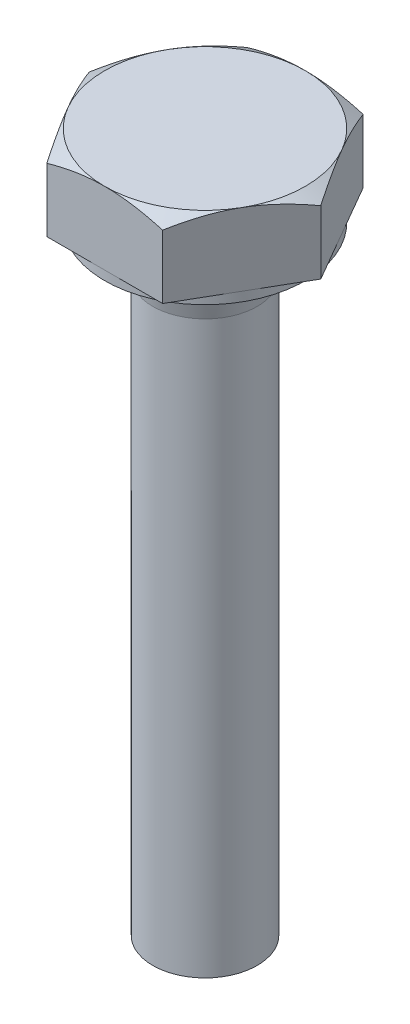
ISO-10303-21;
HEADER;
FILE_DESCRIPTION(('STEP AP214'),'2;1');
FILE_NAME('part.step','',(''),(''),'','','');
FILE_SCHEMA(('AUTOMOTIVE_DESIGN { 1 0 10303 214 1 1 1 1 }'));
ENDSEC;
DATA;
#1=APPLICATION_CONTEXT('core data for automotive mechanical design processes');
#2=APPLICATION_PROTOCOL_DEFINITION('international standard','automotive_design',2000,#1);
#3=PRODUCT_CONTEXT('',#1,'mechanical');
#4=PRODUCT('Part','Part','',(#3));
#5=PRODUCT_RELATED_PRODUCT_CATEGORY('part','',(#4));
#6=PRODUCT_DEFINITION_FORMATION('','',#4);
#7=PRODUCT_DEFINITION_CONTEXT('part definition',#1,'design');
#8=PRODUCT_DEFINITION('design','',#6,#7);
#9=PRODUCT_DEFINITION_SHAPE('','',#8);
#10=(LENGTH_UNIT() NAMED_UNIT(*) SI_UNIT(.MILLI.,.METRE.));
#11=(NAMED_UNIT(*) PLANE_ANGLE_UNIT() SI_UNIT($,.RADIAN.));
#12=(NAMED_UNIT(*) SI_UNIT($,.STERADIAN.) SOLID_ANGLE_UNIT());
#13=UNCERTAINTY_MEASURE_WITH_UNIT(LENGTH_MEASURE(1.E-05),#10,'distance_accuracy_value','');
#14=(GEOMETRIC_REPRESENTATION_CONTEXT(3) GLOBAL_UNCERTAINTY_ASSIGNED_CONTEXT((#13)) GLOBAL_UNIT_ASSIGNED_CONTEXT((#10,
#11,#12)) REPRESENTATION_CONTEXT('',''));
#15=CARTESIAN_POINT('',(0.,0.,0.));
#16=DIRECTION('',(0.,0.,1.));
#17=DIRECTION('',(1.,0.,0.));
#18=AXIS2_PLACEMENT_3D('',#15,#16,#17);
#19=CARTESIAN_POINT('',(7.5055,0.6,0.));
#20=DIRECTION('',(0.,1.,0.));
#21=DIRECTION('',(-1.,0.,0.));
#22=AXIS2_PLACEMENT_3D('',#19,#20,#21);
#23=PLANE('',#22);
#24=DIRECTION('',(-1.,0.,0.));
#25=VECTOR('',#24,1.);
#26=CARTESIAN_POINT('',(7.5055,0.6,-6.5));
#27=LINE('',#26,#25);
#28=CARTESIAN_POINT('',(3.75266974965824,0.599999999999997,-6.5));
#29=VERTEX_POINT('',#28);
#30=CARTESIAN_POINT('',(0.,0.599999999999999,-6.5));
#31=VERTEX_POINT('',#30);
#32=EDGE_CURVE('E315',#29,#31,#27,.T.);
#33=ORIENTED_EDGE('',*,*,#32,.F.);
#34=CARTESIAN_POINT('',(0.,0.599999999999999,0.));
#35=DIRECTION('',(0.,1.,0.));
#36=DIRECTION('',(-1.,0.,0.));
#37=AXIS2_PLACEMENT_3D('',#34,#35,#36);
#38=CIRCLE('',#37,7.5055);
#39=CARTESIAN_POINT('',(3.75283024976971,0.599999999999997,-6.49990733521743));
#40=VERTEX_POINT('',#39);
#41=EDGE_CURVE('E343',#40,#29,#38,.T.);
#42=ORIENTED_EDGE('',*,*,#41,.F.);
#43=DIRECTION('',(-0.499999999999999,0.,-0.866025403784439));
#44=VECTOR('',#43,1.);
#45=CARTESIAN_POINT('',(7.50554012459883,0.6,-2.31659479366357E-05));
#46=LINE('',#45,#44);
#47=CARTESIAN_POINT('',(5.62916512459884,0.6,-3.24999999999998));
#48=VERTEX_POINT('',#47);
#49=EDGE_CURVE('E309',#48,#40,#46,.T.);
#50=ORIENTED_EDGE('',*,*,#49,.F.);
#51=CARTESIAN_POINT('',(0.,0.599999999999999,0.));
#52=DIRECTION('',(0.,1.,0.));
#53=DIRECTION('',(-1.,0.,0.));
#54=AXIS2_PLACEMENT_3D('',#51,#52,#53);
#55=CIRCLE('',#54,6.5);
#56=EDGE_CURVE('E365',#48,#31,#55,.T.);
#57=ORIENTED_EDGE('',*,*,#56,.T.);
#58=EDGE_LOOP('',(#33,#42,#50,#57));
#59=FACE_BOUND('',#58,.T.);
#60=ADVANCED_FACE('F34',(#59),#23,.F.);
#61=CARTESIAN_POINT('',(-3.75266974965824,0.599999999999997,-6.5));
#62=VERTEX_POINT('',#61);
#63=EDGE_CURVE('E314',#31,#62,#27,.T.);
#64=ORIENTED_EDGE('',*,*,#63,.F.);
#65=CARTESIAN_POINT('',(-5.62916512459884,0.599999999999998,-3.24999999999999));
#66=VERTEX_POINT('',#65);
#67=EDGE_CURVE('E363',#31,#66,#55,.T.);
#68=ORIENTED_EDGE('',*,*,#67,.T.);
#69=DIRECTION('',(-0.499999999999999,0.,0.866025403784439));
#70=VECTOR('',#69,1.);
#71=CARTESIAN_POINT('',(-3.75279012459885,0.599999999999998,-6.49997683405203));
#72=LINE('',#71,#70);
#73=CARTESIAN_POINT('',(-3.75283024976972,0.599999999999997,-6.49990733521743));
#74=VERTEX_POINT('',#73);
#75=EDGE_CURVE('E269',#74,#66,#72,.T.);
#76=ORIENTED_EDGE('',*,*,#75,.F.);
#77=EDGE_CURVE('E173',#62,#74,#38,.T.);
#78=ORIENTED_EDGE('',*,*,#77,.F.);
#79=EDGE_LOOP('',(#64,#68,#76,#78));
#80=FACE_BOUND('',#79,.T.);
#81=ADVANCED_FACE('F227',(#80),#23,.F.);
#82=CARTESIAN_POINT('',(7.50549999942797,0.599999999999997,-9.26647825364585E-05));
#83=VERTEX_POINT('',#82);
#84=EDGE_CURVE('E308',#83,#48,#46,.T.);
#85=ORIENTED_EDGE('',*,*,#84,.F.);
#86=CARTESIAN_POINT('',(7.50549999942797,0.599999999999997,9.26647825325554E-05));
#87=VERTEX_POINT('',#86);
#88=EDGE_CURVE('E346',#87,#83,#38,.T.);
#89=ORIENTED_EDGE('',*,*,#88,.F.);
#90=DIRECTION('',(0.499999999999999,0.,-0.866025403784439));
#91=VECTOR('',#90,1.);
#92=CARTESIAN_POINT('',(7.50554012459883,0.6,2.31659479359852E-05));
#93=LINE('',#92,#91);
#94=CARTESIAN_POINT('',(5.62916512459884,0.6,3.24999999999998));
#95=VERTEX_POINT('',#94);
#96=EDGE_CURVE('E422',#95,#87,#93,.T.);
#97=ORIENTED_EDGE('',*,*,#96,.F.);
#98=EDGE_CURVE('E368',#95,#48,#55,.T.);
#99=ORIENTED_EDGE('',*,*,#98,.T.);
#100=EDGE_LOOP('',(#85,#89,#97,#99));
#101=FACE_BOUND('',#100,.T.);
#102=ADVANCED_FACE('F234',(#101),#23,.F.);
#103=CARTESIAN_POINT('',(3.75283024976971,0.599999999999997,6.49990733521743));
#104=VERTEX_POINT('',#103);
#105=EDGE_CURVE('E380',#104,#95,#93,.T.);
#106=ORIENTED_EDGE('',*,*,#105,.F.);
#107=CARTESIAN_POINT('',(3.75266974965824,0.599999999999997,6.5));
#108=VERTEX_POINT('',#107);
#109=EDGE_CURVE('E348',#108,#104,#38,.T.);
#110=ORIENTED_EDGE('',*,*,#109,.F.);
#111=DIRECTION('',(1.,0.,0.));
#112=VECTOR('',#111,1.);
#113=CARTESIAN_POINT('',(7.5055,0.6,6.5));
#114=LINE('',#113,#112);
#115=CARTESIAN_POINT('',(0.,0.599999999999999,6.5));
#116=VERTEX_POINT('',#115);
#117=EDGE_CURVE('E381',#116,#108,#114,.T.);
#118=ORIENTED_EDGE('',*,*,#117,.F.);
#119=EDGE_CURVE('E196',#116,#95,#55,.T.);
#120=ORIENTED_EDGE('',*,*,#119,.T.);
#121=EDGE_LOOP('',(#106,#110,#118,#120));
#122=FACE_BOUND('',#121,.T.);
#123=ADVANCED_FACE('F248',(#122),#23,.F.);
#124=CARTESIAN_POINT('',(-3.75266974965824,0.599999999999997,6.5));
#125=VERTEX_POINT('',#124);
#126=EDGE_CURVE('E386',#125,#116,#114,.T.);
#127=ORIENTED_EDGE('',*,*,#126,.F.);
#128=CARTESIAN_POINT('',(-3.75283024976973,0.599999999999997,6.49990733521742));
#129=VERTEX_POINT('',#128);
#130=EDGE_CURVE('E191',#129,#125,#38,.T.);
#131=ORIENTED_EDGE('',*,*,#130,.F.);
#132=DIRECTION('',(0.499999999999998,0.,0.86602540378444));
#133=VECTOR('',#132,1.);
#134=CARTESIAN_POINT('',(-3.75279012459886,0.599999999999998,6.49997683405202));
#135=LINE('',#134,#133);
#136=CARTESIAN_POINT('',(-5.62916512459885,0.599999999999998,3.24999999999998));
#137=VERTEX_POINT('',#136);
#138=EDGE_CURVE('E260',#137,#129,#135,.T.);
#139=ORIENTED_EDGE('',*,*,#138,.F.);
#140=EDGE_CURVE('E192',#137,#116,#55,.T.);
#141=ORIENTED_EDGE('',*,*,#140,.T.);
#142=EDGE_LOOP('',(#127,#131,#139,#141));
#143=FACE_BOUND('',#142,.T.);
#144=ADVANCED_FACE('F240',(#143),#23,.F.);
#145=CARTESIAN_POINT('',(-7.50549999942797,0.599999999999997,9.2664782541229E-05));
#146=VERTEX_POINT('',#145);
#147=EDGE_CURVE('E253',#146,#137,#135,.T.);
#148=ORIENTED_EDGE('',*,*,#147,.F.);
#149=CARTESIAN_POINT('',(-7.50549999942797,0.599999999999997,-9.26647825420963E-05));
#150=VERTEX_POINT('',#149);
#151=EDGE_CURVE('E188',#150,#146,#38,.T.);
#152=ORIENTED_EDGE('',*,*,#151,.F.);
#153=EDGE_CURVE('E267',#66,#150,#72,.T.);
#154=ORIENTED_EDGE('',*,*,#153,.F.);
#155=EDGE_CURVE('E197',#66,#137,#55,.T.);
#156=ORIENTED_EDGE('',*,*,#155,.T.);
#157=EDGE_LOOP('',(#148,#152,#154,#156));
#158=FACE_BOUND('',#157,.T.);
#159=ADVANCED_FACE('F230',(#158),#23,.F.);
#160=CARTESIAN_POINT('',(0.,5.3,0.));
#161=DIRECTION('',(0.,1.,0.));
#162=DIRECTION('',(-1.,0.,0.));
#163=AXIS2_PLACEMENT_3D('',#160,#161,#162);
#164=CYLINDRICAL_SURFACE('',#163,7.5055);
#165=DIRECTION('',(0.,1.,0.));
#166=VECTOR('',#165,1.);
#167=CARTESIAN_POINT('',(-3.75266974965824,5.3,-6.5));
#168=LINE('',#167,#166);
#169=CARTESIAN_POINT('',(-3.75266974965824,4.71947430432983,-6.5));
#170=VERTEX_POINT('',#169);
#171=EDGE_CURVE('E313',#62,#170,#168,.T.);
#172=ORIENTED_EDGE('',*,*,#171,.F.);
#173=ORIENTED_EDGE('',*,*,#77,.T.);
#174=DIRECTION('',(0.,1.,0.));
#175=VECTOR('',#174,1.);
#176=CARTESIAN_POINT('',(-3.75283024976972,5.3,-6.49990733521743));
#177=LINE('',#176,#175);
#178=CARTESIAN_POINT('',(-3.75283024976972,4.71947430432983,-6.49990733521743));
#179=VERTEX_POINT('',#178);
#180=EDGE_CURVE('E159',#179,#74,#177,.F.);
#181=ORIENTED_EDGE('',*,*,#180,.F.);
#182=CARTESIAN_POINT('',(0.,4.71947430432983,0.));
#183=DIRECTION('',(0.,1.,0.));
#184=DIRECTION('',(-1.,0.,0.));
#185=AXIS2_PLACEMENT_3D('',#182,#183,#184);
#186=CIRCLE('',#185,7.5055);
#187=EDGE_CURVE('E171',#170,#179,#186,.T.);
#188=ORIENTED_EDGE('',*,*,#187,.F.);
#189=EDGE_LOOP('',(#172,#173,#181,#188));
#190=FACE_BOUND('',#189,.T.);
#191=ADVANCED_FACE('F170',(#190),#164,.T.);
#192=DIRECTION('',(0.,1.,0.));
#193=VECTOR('',#192,1.);
#194=CARTESIAN_POINT('',(3.75266974965823,5.3,-6.5));
#195=LINE('',#194,#193);
#196=CARTESIAN_POINT('',(3.75266974965823,4.71947430432983,-6.5));
#197=VERTEX_POINT('',#196);
#198=EDGE_CURVE('E311',#197,#29,#195,.F.);
#199=ORIENTED_EDGE('',*,*,#198,.F.);
#200=CARTESIAN_POINT('',(3.75283024976971,4.71947430432983,-6.49990733521743));
#201=VERTEX_POINT('',#200);
#202=EDGE_CURVE('E177',#201,#197,#186,.T.);
#203=ORIENTED_EDGE('',*,*,#202,.F.);
#204=DIRECTION('',(0.,1.,0.));
#205=VECTOR('',#204,1.);
#206=CARTESIAN_POINT('',(3.75283024976971,5.3,-6.49990733521743));
#207=LINE('',#206,#205);
#208=EDGE_CURVE('E344',#40,#201,#207,.T.);
#209=ORIENTED_EDGE('',*,*,#208,.F.);
#210=ORIENTED_EDGE('',*,*,#41,.T.);
#211=EDGE_LOOP('',(#199,#203,#209,#210));
#212=FACE_BOUND('',#211,.T.);
#213=ADVANCED_FACE('F246',(#212),#164,.T.);
#214=DIRECTION('',(0.,1.,0.));
#215=VECTOR('',#214,1.);
#216=CARTESIAN_POINT('',(7.50549999942797,5.3,-9.26647825364585E-05));
#217=LINE('',#216,#215);
#218=CARTESIAN_POINT('',(7.50549999942797,4.71947430432983,-9.26647825360143E-05));
#219=VERTEX_POINT('',#218);
#220=EDGE_CURVE('E423',#219,#83,#217,.F.);
#221=ORIENTED_EDGE('',*,*,#220,.F.);
#222=CARTESIAN_POINT('',(7.50549999942797,4.71947430432983,9.266478253305E-05));
#223=VERTEX_POINT('',#222);
#224=EDGE_CURVE('E181',#223,#219,#186,.T.);
#225=ORIENTED_EDGE('',*,*,#224,.F.);
#226=DIRECTION('',(0.,1.,0.));
#227=VECTOR('',#226,1.);
#228=CARTESIAN_POINT('',(7.50549999942797,5.3,9.26647825325554E-05));
#229=LINE('',#228,#227);
#230=EDGE_CURVE('E424',#87,#223,#229,.T.);
#231=ORIENTED_EDGE('',*,*,#230,.F.);
#232=ORIENTED_EDGE('',*,*,#88,.T.);
#233=EDGE_LOOP('',(#221,#225,#231,#232));
#234=FACE_BOUND('',#233,.T.);
#235=ADVANCED_FACE('F438',(#234),#164,.T.);
#236=DIRECTION('',(0.,1.,0.));
#237=VECTOR('',#236,1.);
#238=CARTESIAN_POINT('',(3.75283024976971,5.3,6.49990733521743));
#239=LINE('',#238,#237);
#240=CARTESIAN_POINT('',(3.75283024976971,4.71947430432983,6.49990733521743));
#241=VERTEX_POINT('',#240);
#242=EDGE_CURVE('E405',#241,#104,#239,.F.);
#243=ORIENTED_EDGE('',*,*,#242,.F.);
#244=CARTESIAN_POINT('',(3.75266974965824,4.71947430432983,6.5));
#245=VERTEX_POINT('',#244);
#246=EDGE_CURVE('E435',#245,#241,#186,.T.);
#247=ORIENTED_EDGE('',*,*,#246,.F.);
#248=DIRECTION('',(0.,1.,0.));
#249=VECTOR('',#248,1.);
#250=CARTESIAN_POINT('',(3.75266974965824,5.3,6.5));
#251=LINE('',#250,#249);
#252=EDGE_CURVE('E396',#108,#245,#251,.T.);
#253=ORIENTED_EDGE('',*,*,#252,.F.);
#254=ORIENTED_EDGE('',*,*,#109,.T.);
#255=EDGE_LOOP('',(#243,#247,#253,#254));
#256=FACE_BOUND('',#255,.T.);
#257=ADVANCED_FACE('F446',(#256),#164,.T.);
#258=DIRECTION('',(0.,1.,0.));
#259=VECTOR('',#258,1.);
#260=CARTESIAN_POINT('',(-3.75266974965824,5.3,6.5));
#261=LINE('',#260,#259);
#262=CARTESIAN_POINT('',(-3.75266974965824,4.71947430432983,6.5));
#263=VERTEX_POINT('',#262);
#264=EDGE_CURVE('E394',#263,#125,#261,.F.);
#265=ORIENTED_EDGE('',*,*,#264,.F.);
#266=CARTESIAN_POINT('',(-3.75283024976973,4.71947430432983,6.49990733521742));
#267=VERTEX_POINT('',#266);
#268=EDGE_CURVE('E184',#267,#263,#186,.T.);
#269=ORIENTED_EDGE('',*,*,#268,.F.);
#270=DIRECTION('',(0.,1.,0.));
#271=VECTOR('',#270,1.);
#272=CARTESIAN_POINT('',(-3.75283024976973,5.3,6.49990733521742));
#273=LINE('',#272,#271);
#274=EDGE_CURVE('E387',#129,#267,#273,.T.);
#275=ORIENTED_EDGE('',*,*,#274,.F.);
#276=ORIENTED_EDGE('',*,*,#130,.T.);
#277=EDGE_LOOP('',(#265,#269,#275,#276));
#278=FACE_BOUND('',#277,.T.);
#279=ADVANCED_FACE('F444',(#278),#164,.T.);
#280=DIRECTION('',(0.,1.,0.));
#281=VECTOR('',#280,1.);
#282=CARTESIAN_POINT('',(-7.50549999942797,5.3,9.2664782541229E-05));
#283=LINE('',#282,#281);
#284=CARTESIAN_POINT('',(-7.50549999942797,4.71947430432983,9.26647825418863E-05));
#285=VERTEX_POINT('',#284);
#286=EDGE_CURVE('E266',#285,#146,#283,.F.);
#287=ORIENTED_EDGE('',*,*,#286,.F.);
#288=CARTESIAN_POINT('',(-7.50549999942797,4.71947430432983,-9.26647825417646E-05));
#289=VERTEX_POINT('',#288);
#290=EDGE_CURVE('E178',#289,#285,#186,.T.);
#291=ORIENTED_EDGE('',*,*,#290,.F.);
#292=DIRECTION('',(0.,1.,0.));
#293=VECTOR('',#292,1.);
#294=CARTESIAN_POINT('',(-7.50549999942797,5.3,-9.26647825420963E-05));
#295=LINE('',#294,#293);
#296=EDGE_CURVE('E174',#150,#289,#295,.T.);
#297=ORIENTED_EDGE('',*,*,#296,.F.);
#298=ORIENTED_EDGE('',*,*,#151,.T.);
#299=EDGE_LOOP('',(#287,#291,#297,#298));
#300=FACE_BOUND('',#299,.T.);
#301=ADVANCED_FACE('F247',(#300),#164,.T.);
#302=CARTESIAN_POINT('',(0.,4.71947430432983,0.));
#303=DIRECTION('',(0.,-1.,0.));
#304=DIRECTION('',(1.,0.,0.));
#305=AXIS2_PLACEMENT_3D('',#302,#303,#304);
#306=CONICAL_SURFACE('',#305,7.5055,1.0471975511966);
#307=CARTESIAN_POINT('',(-9.95291269947967,2.18957848644785,-6.5));
#308=CARTESIAN_POINT('',(-9.6675259773592,2.32749309742783,-6.5));
#309=CARTESIAN_POINT('',(-9.38146450432171,2.46403672116243,-6.5));
#310=CARTESIAN_POINT('',(-8.80762722394583,2.7335985660454,-6.5));
#311=CARTESIAN_POINT('',(-8.51985113021541,2.86661617680852,-6.5));
#312=CARTESIAN_POINT('',(-7.94066523066116,3.12904331265472,-6.5));
#313=CARTESIAN_POINT('',(-7.64924405469006,3.25842783400536,-6.5));
#314=CARTESIAN_POINT('',(-7.06400645896563,3.51163948742872,-6.5));
#315=CARTESIAN_POINT('',(-6.77019016501115,3.63546690918299,-6.5));
#316=CARTESIAN_POINT('',(-6.17604762701244,3.87755673999455,-6.5));
#317=CARTESIAN_POINT('',(-5.87568574557131,3.99573216501375,-6.5));
#318=CARTESIAN_POINT('',(-5.27141895767034,4.22282746608413,-6.5));
#319=CARTESIAN_POINT('',(-4.96751366128924,4.33174631238885,-6.5));
#320=CARTESIAN_POINT('',(-4.35630181726158,4.53740213616556,-6.5));
#321=CARTESIAN_POINT('',(-4.04900407206332,4.63416501226556,-6.5));
#322=CARTESIAN_POINT('',(-3.43003676090721,4.81236522173217,-6.5));
#323=CARTESIAN_POINT('',(-3.11836861110241,4.89380740158612,-6.5));
#324=CARTESIAN_POINT('',(-2.49046262633262,5.0374166069193,-6.5));
#325=CARTESIAN_POINT('',(-2.17422359799008,5.09957849991129,-6.5));
#326=CARTESIAN_POINT('',(-1.53788849691383,5.20042620033131,-6.5));
#327=CARTESIAN_POINT('',(-1.21779242076947,5.23911198699878,-6.5));
#328=CARTESIAN_POINT('',(-0.737138914817065,5.27705363612799,-6.5));
#329=CARTESIAN_POINT('',(-0.577333864138186,5.28635493938451,-6.5));
#330=CARTESIAN_POINT('',(-0.257465936730629,5.29818597961714,-6.5));
#331=CARTESIAN_POINT('',(-0.0974030633771391,5.30071580453011,-6.5));
#332=CARTESIAN_POINT('',(0.222638328627014,5.29893593089712,-6.5));
#333=CARTESIAN_POINT('',(0.382616858344424,5.29462815183897,-6.5));
#334=CARTESIAN_POINT('',(0.702253433016712,5.27928224340891,-6.5));
#335=CARTESIAN_POINT('',(0.861911461567568,5.26824377793354,-6.5));
#336=CARTESIAN_POINT('',(1.24887336524002,5.23356282461755,-6.5));
#337=CARTESIAN_POINT('',(1.47587987136213,5.20654774859047,-6.5));
#338=CARTESIAN_POINT('',(1.92815341231725,5.1404096028995,-6.5));
#339=CARTESIAN_POINT('',(2.15341995514116,5.1012832283723,-6.5));
#340=CARTESIAN_POINT('',(2.6020276496592,5.01231010679479,-6.5));
#341=CARTESIAN_POINT('',(2.82536677176941,4.96245322355412,-6.5));
#342=CARTESIAN_POINT('',(3.26974717680381,4.8535402946474,-6.5));
#343=CARTESIAN_POINT('',(3.49078867410521,4.79448511558719,-6.5));
#344=CARTESIAN_POINT('',(3.93601802117897,4.66704472446996,-6.5));
#345=CARTESIAN_POINT('',(4.16015018317409,4.59846629640647,-6.5));
#346=CARTESIAN_POINT('',(4.60604542478353,4.45453350457655,-6.5));
#347=CARTESIAN_POINT('',(4.82781002203382,4.37918381444797,-6.5));
#348=CARTESIAN_POINT('',(5.26808027322029,4.2232649191793,-6.5));
#349=CARTESIAN_POINT('',(5.48659724474679,4.14272748021712,-6.5));
#350=CARTESIAN_POINT('',(5.92193579991885,3.97692551915033,-6.5));
#351=CARTESIAN_POINT('',(6.13875665736554,3.89165908651638,-6.5));
#352=CARTESIAN_POINT('',(6.35478982902261,3.8044959591292,-6.5));
#353=B_SPLINE_CURVE_WITH_KNOTS('',3,(#307,#308,#309,#310,#311,#312,#313,#314,#315,#316,#317,
#318,#319,#320,#321,#322,#323,#324,#325,#326,#327,#328,#329,#330,#331,#332,#333,#334,#335,#336,
#337,#338,#339,#340,#341,#342,#343,#344,#345,#346,#347,#348,#349,#350,#351,#352),.UNSPECIFIED.,
.F.,.F.,(4,2,2,2,2,2,2,2,2,2,2,2,2,2,2,2,2,2,2,2,2,2,4),(0.,0.950904028508479,1.90197160625741,
2.85848176713614,3.81494200881637,4.78314454868004,5.75145465546106,6.71766544283005,
7.68357006709837,8.64973159867958,9.61589398466221,10.0959986257968,10.5760970320903,
11.0560606864915,11.5360483103126,12.2214914630235,12.9071218207522,13.593402699626,
14.279618960479,14.9826558440908,15.6852111532502,16.3838120072837,17.082697183989),.UNSPECIFIED.);
#354=CARTESIAN_POINT('',(0.,5.3,-6.5));
#355=VERTEX_POINT('',#354);
#356=EDGE_CURVE('E57',#170,#355,#353,.T.);
#357=ORIENTED_EDGE('',*,*,#356,.F.);
#358=ORIENTED_EDGE('',*,*,#187,.T.);
#359=CARTESIAN_POINT('',(-7.50566896951895,4.71937674819414,0.000200000000001255));
#360=CARTESIAN_POINT('',(-7.42317863007018,4.76699557692452,-0.142677459058879));
#361=CARTESIAN_POINT('',(-7.34038072665456,4.8124532993973,-0.286087634534911));
#362=CARTESIAN_POINT('',(-7.17411251123974,4.89845131797696,-0.574072631317193));
#363=CARTESIAN_POINT('',(-7.09064192560663,4.93898949277198,-0.718647926571262));
#364=CARTESIAN_POINT('',(-6.83889369625717,5.0524289988768,-1.15468865052003));
#365=CARTESIAN_POINT('',(-6.66962231516079,5.11695219287127,-1.44787528284632));
#366=CARTESIAN_POINT('',(-6.41631077211553,5.19261341645251,-1.88662374554437));
#367=CARTESIAN_POINT('',(-6.33302748139453,5.21416714354302,-2.03087463649469));
#368=CARTESIAN_POINT('',(-6.16608458377292,5.25030968539389,-2.32002821713808));
#369=CARTESIAN_POINT('',(-6.08242501078141,5.26489911554034,-2.46493084809888));
#370=CARTESIAN_POINT('',(-5.91496056339805,5.28674124749266,-2.75498777942831));
#371=CARTESIAN_POINT('',(-5.83115596252169,5.2940022756779,-2.9001416060542));
#372=CARTESIAN_POINT('',(-5.66347396979286,5.30103969741777,-3.19057533697494));
#373=CARTESIAN_POINT('',(-5.57959658026909,5.3008163221878,-3.33585523723635));
#374=CARTESIAN_POINT('',(-5.34979921898452,5.28991654148484,-3.73387594242649));
#375=CARTESIAN_POINT('',(-5.20395446807006,5.27161818213059,-3.98648646102756));
#376=CARTESIAN_POINT('',(-4.91323365606635,5.21359365854233,-4.49002967823567));
#377=CARTESIAN_POINT('',(-4.76835861741225,5.17384766146176,-4.74096060593308));
#378=CARTESIAN_POINT('',(-4.47705272008731,5.07449409679785,-5.24551722064432));
#379=CARTESIAN_POINT('',(-4.33065861912702,5.01446557436198,-5.49907924143591));
#380=CARTESIAN_POINT('',(-4.04005357906493,4.87822500749013,-6.00242193575904));
#381=CARTESIAN_POINT('',(-3.89583891821181,4.80204496583641,-6.25220905555296));
#382=CARTESIAN_POINT('',(-3.75266127967872,4.71937674819413,-6.5002));
#383=B_SPLINE_CURVE_WITH_KNOTS('',3,(#359,#360,#361,#362,#363,#364,#365,#366,#367,#368,#369,
#370,#371,#372,#373,#374,#375,#376,#377,#378,#379,#380,#381,#382),.UNSPECIFIED.,.F.,.F.,(4,2,2,
2,2,2,2,2,2,2,2,4),(0.,0.515105052395586,1.03043143507524,2.06322554824262,2.56697389547996,
3.07067772176453,3.57380860368927,4.07692394242519,4.95279354705659,5.82947446853465,
6.72559912449736,7.61996451221045),.UNSPECIFIED.);
#384=CARTESIAN_POINT('',(-5.62916512459884,5.3,-3.24999999999999));
#385=VERTEX_POINT('',#384);
#386=EDGE_CURVE('E156',#385,#179,#383,.T.);
#387=ORIENTED_EDGE('',*,*,#386,.F.);
#388=CARTESIAN_POINT('',(0.,5.3,0.));
#389=DIRECTION('',(0.,1.,0.));
#390=DIRECTION('',(-1.,0.,0.));
#391=AXIS2_PLACEMENT_3D('',#388,#389,#390);
#392=CIRCLE('',#391,6.5);
#393=EDGE_CURVE('E319',#355,#385,#392,.T.);
#394=ORIENTED_EDGE('',*,*,#393,.F.);
#395=EDGE_LOOP('',(#357,#358,#387,#394));
#396=FACE_BOUND('',#395,.T.);
#397=ADVANCED_FACE('F176',(#396),#306,.T.);
#398=EDGE_CURVE('E302',#355,#197,#353,.T.);
#399=ORIENTED_EDGE('',*,*,#398,.F.);
#400=CARTESIAN_POINT('',(5.62916512459884,5.3,-3.24999999999999));
#401=VERTEX_POINT('',#400);
#402=EDGE_CURVE('E324',#401,#355,#392,.T.);
#403=ORIENTED_EDGE('',*,*,#402,.F.);
#404=CARTESIAN_POINT('',(3.75266127967872,4.71937674819413,-6.5002));
#405=CARTESIAN_POINT('',(3.83515161912749,4.76699557692452,-6.35732254094112));
#406=CARTESIAN_POINT('',(3.91794952254311,4.8124532993973,-6.21391236546509));
#407=CARTESIAN_POINT('',(4.08421773795793,4.89845131797696,-5.92592736868281));
#408=CARTESIAN_POINT('',(4.16768832359104,4.93898949277198,-5.78135207342874));
#409=CARTESIAN_POINT('',(4.4194365529405,5.0524289988768,-5.34531134947997));
#410=CARTESIAN_POINT('',(4.58870793403688,5.11695219287127,-5.05212471715368));
#411=CARTESIAN_POINT('',(4.84201947708213,5.19261341645251,-4.61337625445563));
#412=CARTESIAN_POINT('',(4.92530276780314,5.21416714354302,-4.46912536350531));
#413=CARTESIAN_POINT('',(5.09224566542475,5.25030968539389,-4.17997178286191));
#414=CARTESIAN_POINT('',(5.17590523841625,5.26489911554034,-4.03506915190111));
#415=CARTESIAN_POINT('',(5.34336968579962,5.28674124749266,-3.74501222057168));
#416=CARTESIAN_POINT('',(5.42717428667598,5.2940022756779,-3.59985839394579));
#417=CARTESIAN_POINT('',(5.59485627940482,5.30103969741778,-3.30942466302505));
#418=CARTESIAN_POINT('',(5.67873366892858,5.3008163221878,-3.16414476276364));
#419=CARTESIAN_POINT('',(5.90853103021315,5.28991654148484,-2.76612405757351));
#420=CARTESIAN_POINT('',(6.05437578112761,5.2716181821306,-2.51351353897243));
#421=CARTESIAN_POINT('',(6.34509659313132,5.21359365854234,-2.00997032176432));
#422=CARTESIAN_POINT('',(6.48997163178542,5.17384766146177,-1.75903939406692));
#423=CARTESIAN_POINT('',(6.78127752911036,5.07449409679786,-1.25448277935568));
#424=CARTESIAN_POINT('',(6.92767163007065,5.01446557436199,-1.00092075856409));
#425=CARTESIAN_POINT('',(7.21827667013274,4.87822500749015,-0.497578064240956));
#426=CARTESIAN_POINT('',(7.36249133098586,4.80204496583642,-0.247790944447038));
#427=CARTESIAN_POINT('',(7.50566896951895,4.71937674819415,0.000199999999999552));
#428=B_SPLINE_CURVE_WITH_KNOTS('',3,(#404,#405,#406,#407,#408,#409,#410,#411,#412,#413,#414,
#415,#416,#417,#418,#419,#420,#421,#422,#423,#424,#425,#426,#427),.UNSPECIFIED.,.F.,.F.,(4,2,2,
2,2,2,2,2,2,2,2,4),(0.,0.515105052395586,1.03043143507524,2.06322554824262,2.56697389547996,
3.07067772176454,3.57380860368928,4.0769239424252,4.9527935470566,5.82947446853466,
6.72559912449736,7.61996451221045),.UNSPECIFIED.);
#429=EDGE_CURVE('E336',#201,#401,#428,.T.);
#430=ORIENTED_EDGE('',*,*,#429,.F.);
#431=ORIENTED_EDGE('',*,*,#202,.T.);
#432=EDGE_LOOP('',(#399,#403,#430,#431));
#433=FACE_BOUND('',#432,.T.);
#434=ADVANCED_FACE('F335',(#433),#306,.T.);
#435=EDGE_CURVE('E416',#401,#219,#428,.T.);
#436=ORIENTED_EDGE('',*,*,#435,.F.);
#437=CARTESIAN_POINT('',(5.62916512459884,5.3,3.24999999999998));
#438=VERTEX_POINT('',#437);
#439=EDGE_CURVE('E327',#438,#401,#392,.T.);
#440=ORIENTED_EDGE('',*,*,#439,.F.);
#441=CARTESIAN_POINT('',(7.50566896951895,4.71937674819415,-0.000200000000000583));
#442=CARTESIAN_POINT('',(7.42317863007017,4.76699557692453,0.142677459058879));
#443=CARTESIAN_POINT('',(7.34038072665455,4.81245329939731,0.286087634534911));
#444=CARTESIAN_POINT('',(7.17411251123973,4.89845131797697,0.574072631317193));
#445=CARTESIAN_POINT('',(7.09064192560663,4.93898949277199,0.718647926571261));
#446=CARTESIAN_POINT('',(6.83889369625717,5.0524289988768,1.15468865052003));
#447=CARTESIAN_POINT('',(6.66962231516079,5.11695219287127,1.44787528284632));
#448=CARTESIAN_POINT('',(6.41631077211553,5.19261341645252,1.88662374554437));
#449=CARTESIAN_POINT('',(6.33302748139452,5.21416714354302,2.03087463649468));
#450=CARTESIAN_POINT('',(6.16608458377291,5.25030968539389,2.32002821713808));
#451=CARTESIAN_POINT('',(6.08242501078141,5.26489911554034,2.46493084809888));
#452=CARTESIAN_POINT('',(5.91496056339805,5.28674124749266,2.75498777942831));
#453=CARTESIAN_POINT('',(5.83115596252169,5.2940022756779,2.9001416060542));
#454=CARTESIAN_POINT('',(5.66347396979285,5.30103969741778,3.19057533697494));
#455=CARTESIAN_POINT('',(5.57959658026909,5.3008163221878,3.33585523723635));
#456=CARTESIAN_POINT('',(5.34979921898452,5.28991654148484,3.73387594242649));
#457=CARTESIAN_POINT('',(5.20395446807005,5.2716181821306,3.98648646102756));
#458=CARTESIAN_POINT('',(4.91323365606634,5.21359365854233,4.49002967823567));
#459=CARTESIAN_POINT('',(4.76835861741224,5.17384766146176,4.74096060593308));
#460=CARTESIAN_POINT('',(4.4770527200873,5.07449409679786,5.24551722064432));
#461=CARTESIAN_POINT('',(4.33065861912701,5.01446557436198,5.49907924143591));
#462=CARTESIAN_POINT('',(4.04005357906492,4.87822500749014,6.00242193575904));
#463=CARTESIAN_POINT('',(3.8958389182118,4.80204496583641,6.25220905555296));
#464=CARTESIAN_POINT('',(3.75266127967871,4.71937674819414,6.5002));
#465=B_SPLINE_CURVE_WITH_KNOTS('',3,(#441,#442,#443,#444,#445,#446,#447,#448,#449,#450,#451,
#452,#453,#454,#455,#456,#457,#458,#459,#460,#461,#462,#463,#464),.UNSPECIFIED.,.F.,.F.,(4,2,2,
2,2,2,2,2,2,2,2,4),(0.,0.515105052395586,1.03043143507524,2.06322554824262,2.56697389547995,
3.07067772176453,3.57380860368927,4.07692394242519,4.95279354705659,5.82947446853465,
6.72559912449736,7.61996451221045),.UNSPECIFIED.);
#466=EDGE_CURVE('E404',#223,#438,#465,.T.);
#467=ORIENTED_EDGE('',*,*,#466,.F.);
#468=ORIENTED_EDGE('',*,*,#224,.T.);
#469=EDGE_LOOP('',(#436,#440,#467,#468));
#470=FACE_BOUND('',#469,.T.);
#471=ADVANCED_FACE('F437',(#470),#306,.T.);
#472=EDGE_CURVE('E399',#438,#241,#465,.T.);
#473=ORIENTED_EDGE('',*,*,#472,.F.);
#474=CARTESIAN_POINT('',(0.,5.3,6.5));
#475=VERTEX_POINT('',#474);
#476=EDGE_CURVE('E325',#475,#438,#392,.T.);
#477=ORIENTED_EDGE('',*,*,#476,.F.);
#478=CARTESIAN_POINT('',(-9.95291269947968,2.18957848644784,6.5));
#479=CARTESIAN_POINT('',(-9.66752597735922,2.32749309742783,6.5));
#480=CARTESIAN_POINT('',(-9.38146450432173,2.46403672116242,6.5));
#481=CARTESIAN_POINT('',(-8.80762722394584,2.7335985660454,6.5));
#482=CARTESIAN_POINT('',(-8.51985113021542,2.86661617680851,6.5));
#483=CARTESIAN_POINT('',(-7.94066523066118,3.12904331265471,6.5));
#484=CARTESIAN_POINT('',(-7.64924405469007,3.25842783400536,6.5));
#485=CARTESIAN_POINT('',(-7.06400645896564,3.51163948742872,6.5));
#486=CARTESIAN_POINT('',(-6.77019016501116,3.63546690918299,6.5));
#487=CARTESIAN_POINT('',(-6.17604762701245,3.87755673999455,6.5));
#488=CARTESIAN_POINT('',(-5.87568574557132,3.99573216501375,6.5));
#489=CARTESIAN_POINT('',(-5.27141895767035,4.22282746608413,6.5));
#490=CARTESIAN_POINT('',(-4.96751366128924,4.33174631238884,6.5));
#491=CARTESIAN_POINT('',(-4.35630181726158,4.53740213616555,6.5));
#492=CARTESIAN_POINT('',(-4.04900407206332,4.63416501226556,6.5));
#493=CARTESIAN_POINT('',(-3.43003676090722,4.81236522173217,6.5));
#494=CARTESIAN_POINT('',(-3.11836861110242,4.89380740158612,6.5));
#495=CARTESIAN_POINT('',(-2.49046262633263,5.0374166069193,6.5));
#496=CARTESIAN_POINT('',(-2.17422359799009,5.09957849991129,6.5));
#497=CARTESIAN_POINT('',(-1.53788849691383,5.20042620033131,6.5));
#498=CARTESIAN_POINT('',(-1.21779242076948,5.23911198699878,6.5));
#499=CARTESIAN_POINT('',(-0.737138914817072,5.27705363612799,6.5));
#500=CARTESIAN_POINT('',(-0.577333864138193,5.28635493938451,6.5));
#501=CARTESIAN_POINT('',(-0.257465936730636,5.29818597961714,6.5));
#502=CARTESIAN_POINT('',(-0.0974030633771464,5.30071580453011,6.5));
#503=CARTESIAN_POINT('',(0.222638328627007,5.29893593089712,6.5));
#504=CARTESIAN_POINT('',(0.382616858344417,5.29462815183897,6.5));
#505=CARTESIAN_POINT('',(0.702253433016705,5.27928224340891,6.5));
#506=CARTESIAN_POINT('',(0.861911461567562,5.26824377793354,6.5));
#507=CARTESIAN_POINT('',(1.24887336524001,5.23356282461756,6.5));
#508=CARTESIAN_POINT('',(1.47587987136212,5.20654774859048,6.5));
#509=CARTESIAN_POINT('',(1.92815341231724,5.1404096028995,6.5));
#510=CARTESIAN_POINT('',(2.15341995514115,5.1012832283723,6.5));
#511=CARTESIAN_POINT('',(2.6020276496592,5.0123101067948,6.5));
#512=CARTESIAN_POINT('',(2.8253667717694,4.96245322355412,6.5));
#513=CARTESIAN_POINT('',(3.2697471768038,4.8535402946474,6.5));
#514=CARTESIAN_POINT('',(3.4907886741052,4.79448511558719,6.5));
#515=CARTESIAN_POINT('',(3.93601802117896,4.66704472446996,6.5));
#516=CARTESIAN_POINT('',(4.16015018317408,4.59846629640647,6.5));
#517=CARTESIAN_POINT('',(4.60604542478352,4.45453350457655,6.5));
#518=CARTESIAN_POINT('',(4.82781002203381,4.37918381444798,6.5));
#519=CARTESIAN_POINT('',(5.26808027322028,4.2232649191793,6.5));
#520=CARTESIAN_POINT('',(5.48659724474678,4.14272748021712,6.5));
#521=CARTESIAN_POINT('',(5.92193579991884,3.97692551915034,6.5));
#522=CARTESIAN_POINT('',(6.13875665736553,3.89165908651639,6.5));
#523=CARTESIAN_POINT('',(6.35478982902259,3.8044959591292,6.5));
#524=B_SPLINE_CURVE_WITH_KNOTS('',3,(#478,#479,#480,#481,#482,#483,#484,#485,#486,#487,#488,
#489,#490,#491,#492,#493,#494,#495,#496,#497,#498,#499,#500,#501,#502,#503,#504,#505,#506,#507,
#508,#509,#510,#511,#512,#513,#514,#515,#516,#517,#518,#519,#520,#521,#522,#523),.UNSPECIFIED.,
.F.,.F.,(4,2,2,2,2,2,2,2,2,2,2,2,2,2,2,2,2,2,2,2,2,2,4),(0.,0.950904028508477,1.90197160625742,
2.85848176713614,3.81494200881637,4.78314454868004,5.75145465546106,6.71766544283006,
7.68357006709838,8.64973159867958,9.61589398466222,10.0959986257968,10.5760970320903,
11.0560606864915,11.5360483103126,12.2214914630235,12.9071218207522,13.593402699626,
14.279618960479,14.9826558440908,15.6852111532502,16.3838120072837,17.082697183989),.UNSPECIFIED.);
#525=EDGE_CURVE('E393',#245,#475,#524,.F.);
#526=ORIENTED_EDGE('',*,*,#525,.F.);
#527=ORIENTED_EDGE('',*,*,#246,.T.);
#528=EDGE_LOOP('',(#473,#477,#526,#527));
#529=FACE_BOUND('',#528,.T.);
#530=ADVANCED_FACE('F432',(#529),#306,.T.);
#531=EDGE_CURVE('E259',#475,#263,#524,.F.);
#532=ORIENTED_EDGE('',*,*,#531,.F.);
#533=CARTESIAN_POINT('',(-5.62916512459885,5.3,3.24999999999998));
#534=VERTEX_POINT('',#533);
#535=EDGE_CURVE('E183',#534,#475,#392,.T.);
#536=ORIENTED_EDGE('',*,*,#535,.F.);
#537=CARTESIAN_POINT('',(-3.75266127967873,4.71937674819413,6.5002));
#538=CARTESIAN_POINT('',(-3.8351516191275,4.76699557692451,6.35732254094112));
#539=CARTESIAN_POINT('',(-3.91794952254312,4.81245329939729,6.21391236546509));
#540=CARTESIAN_POINT('',(-4.08421773795795,4.89845131797695,5.9259273686828));
#541=CARTESIAN_POINT('',(-4.16768832359105,4.93898949277197,5.78135207342873));
#542=CARTESIAN_POINT('',(-4.41943655294051,5.05242899887679,5.34531134947996));
#543=CARTESIAN_POINT('',(-4.58870793403689,5.11695219287126,5.05212471715368));
#544=CARTESIAN_POINT('',(-4.84201947708215,5.19261341645251,4.61337625445562));
#545=CARTESIAN_POINT('',(-4.92530276780315,5.21416714354301,4.46912536350531));
#546=CARTESIAN_POINT('',(-5.09224566542476,5.25030968539388,4.17997178286191));
#547=CARTESIAN_POINT('',(-5.17590523841627,5.26489911554034,4.03506915190111));
#548=CARTESIAN_POINT('',(-5.34336968579963,5.28674124749266,3.74501222057168));
#549=CARTESIAN_POINT('',(-5.42717428667599,5.2940022756779,3.59985839394579));
#550=CARTESIAN_POINT('',(-5.59485627940483,5.30103969741777,3.30942466302505));
#551=CARTESIAN_POINT('',(-5.67873366892859,5.3008163221878,3.16414476276364));
#552=CARTESIAN_POINT('',(-5.90853103021316,5.28991654148484,2.7661240575735));
#553=CARTESIAN_POINT('',(-6.05437578112762,5.27161818213059,2.51351353897243));
#554=CARTESIAN_POINT('',(-6.34509659313133,5.21359365854233,2.00997032176432));
#555=CARTESIAN_POINT('',(-6.48997163178543,5.17384766146176,1.75903939406692));
#556=CARTESIAN_POINT('',(-6.78127752911037,5.07449409679786,1.25448277935568));
#557=CARTESIAN_POINT('',(-6.92767163007066,5.01446557436198,1.00092075856409));
#558=CARTESIAN_POINT('',(-7.21827667013275,4.87822500749014,0.497578064240956));
#559=CARTESIAN_POINT('',(-7.36249133098587,4.80204496583642,0.247790944447038));
#560=CARTESIAN_POINT('',(-7.50566896951895,4.71937674819414,-0.000199999999998659));
#561=B_SPLINE_CURVE_WITH_KNOTS('',3,(#537,#538,#539,#540,#541,#542,#543,#544,#545,#546,#547,
#548,#549,#550,#551,#552,#553,#554,#555,#556,#557,#558,#559,#560),.UNSPECIFIED.,.F.,.F.,(4,2,2,
2,2,2,2,2,2,2,2,4),(0.,0.515105052395587,1.03043143507524,2.06322554824262,2.56697389547996,
3.07067772176453,3.57380860368928,4.0769239424252,4.9527935470566,5.82947446853465,
6.72559912449735,7.61996451221044),.UNSPECIFIED.);
#562=EDGE_CURVE('E278',#267,#534,#561,.T.);
#563=ORIENTED_EDGE('',*,*,#562,.F.);
#564=ORIENTED_EDGE('',*,*,#268,.T.);
#565=EDGE_LOOP('',(#532,#536,#563,#564));
#566=FACE_BOUND('',#565,.T.);
#567=ADVANCED_FACE('F223',(#566),#306,.T.);
#568=EDGE_CURVE('E272',#534,#285,#561,.T.);
#569=ORIENTED_EDGE('',*,*,#568,.F.);
#570=EDGE_CURVE('E317',#385,#534,#392,.T.);
#571=ORIENTED_EDGE('',*,*,#570,.F.);
#572=EDGE_CURVE('E49',#289,#385,#383,.T.);
#573=ORIENTED_EDGE('',*,*,#572,.F.);
#574=ORIENTED_EDGE('',*,*,#290,.T.);
#575=EDGE_LOOP('',(#569,#571,#573,#574));
#576=FACE_BOUND('',#575,.T.);
#577=ADVANCED_FACE('F219',(#576),#306,.T.);
#578=CARTESIAN_POINT('',(3.3865,-40.,0.));
#579=DIRECTION('',(0.,1.,0.));
#580=DIRECTION('',(-1.,0.,0.));
#581=AXIS2_PLACEMENT_3D('',#578,#579,#580);
#582=PLANE('',#581);
#583=CARTESIAN_POINT('',(0.,-40.,0.));
#584=DIRECTION('',(0.,1.,0.));
#585=DIRECTION('',(-1.,0.,0.));
#586=AXIS2_PLACEMENT_3D('',#583,#584,#585);
#587=CIRCLE('',#586,3.3865);
#588=CARTESIAN_POINT('',(-3.38649999999999,-40.,0.));
#589=VERTEX_POINT('',#588);
#590=EDGE_CURVE('E12',#589,#589,#587,.T.);
#591=ORIENTED_EDGE('',*,*,#590,.F.);
#592=EDGE_LOOP('',(#591));
#593=FACE_BOUND('',#592,.T.);
#594=ADVANCED_FACE('F36',(#593),#582,.F.);
#595=CARTESIAN_POINT('',(0.,5.3,0.));
#596=DIRECTION('',(0.,1.,0.));
#597=DIRECTION('',(-1.,0.,0.));
#598=AXIS2_PLACEMENT_3D('',#595,#596,#597);
#599=CYLINDRICAL_SURFACE('',#598,3.3865);
#600=CARTESIAN_POINT('',(0.,-3.,0.));
#601=DIRECTION('',(0.,1.,0.));
#602=DIRECTION('',(-1.,0.,0.));
#603=AXIS2_PLACEMENT_3D('',#600,#601,#602);
#604=CIRCLE('',#603,3.3865);
#605=CARTESIAN_POINT('',(-3.3865,-3.,0.));
#606=VERTEX_POINT('',#605);
#607=EDGE_CURVE('E42',#606,#606,#604,.T.);
#608=ORIENTED_EDGE('',*,*,#607,.F.);
#609=EDGE_LOOP('',(#608));
#610=FACE_BOUND('',#609,.T.);
#611=ORIENTED_EDGE('',*,*,#590,.T.);
#612=EDGE_LOOP('',(#611));
#613=FACE_BOUND('',#612,.T.);
#614=ADVANCED_FACE('F213',(#610,#613),#599,.T.);
#615=CARTESIAN_POINT('',(0.,-3.,0.));
#616=DIRECTION('',(0.,1.,0.));
#617=DIRECTION('',(-1.,0.,0.));
#618=AXIS2_PLACEMENT_3D('',#615,#616,#617);
#619=CONICAL_SURFACE('',#618,3.3865,0.201209277219044);
#620=CARTESIAN_POINT('',(0.,-0.00200000000000113,0.));
#621=DIRECTION('',(0.,1.,0.));
#622=DIRECTION('',(-1.,0.,0.));
#623=AXIS2_PLACEMENT_3D('',#620,#621,#622);
#624=CIRCLE('',#623,3.998);
#625=CARTESIAN_POINT('',(-3.998,-0.00200000000000166,0.));
#626=VERTEX_POINT('',#625);
#627=EDGE_CURVE('E206',#626,#626,#624,.T.);
#628=ORIENTED_EDGE('',*,*,#627,.F.);
#629=EDGE_LOOP('',(#628));
#630=FACE_BOUND('',#629,.T.);
#631=ORIENTED_EDGE('',*,*,#607,.T.);
#632=EDGE_LOOP('',(#631));
#633=FACE_BOUND('',#632,.T.);
#634=ADVANCED_FACE('F211',(#630,#633),#619,.T.);
#635=CARTESIAN_POINT('',(4.,-0.00200000000000049,0.));
#636=DIRECTION('',(0.,1.,0.));
#637=DIRECTION('',(-1.,0.,0.));
#638=AXIS2_PLACEMENT_3D('',#635,#636,#637);
#639=PLANE('',#638);
#640=CARTESIAN_POINT('',(0.,-0.00200000000000113,0.));
#641=DIRECTION('',(0.,1.,0.));
#642=DIRECTION('',(-1.,0.,0.));
#643=AXIS2_PLACEMENT_3D('',#640,#641,#642);
#644=CIRCLE('',#643,4.);
#645=CARTESIAN_POINT('',(-4.,-0.00200000000000166,0.));
#646=VERTEX_POINT('',#645);
#647=EDGE_CURVE('E203',#646,#646,#644,.T.);
#648=ORIENTED_EDGE('',*,*,#647,.F.);
#649=EDGE_LOOP('',(#648));
#650=FACE_BOUND('',#649,.T.);
#651=ORIENTED_EDGE('',*,*,#627,.T.);
#652=EDGE_LOOP('',(#651));
#653=FACE_BOUND('',#652,.T.);
#654=ADVANCED_FACE('F507',(#650,#653),#639,.F.);
#655=CARTESIAN_POINT('',(0.,5.3,0.));
#656=DIRECTION('',(0.,1.,0.));
#657=DIRECTION('',(-1.,0.,0.));
#658=AXIS2_PLACEMENT_3D('',#655,#656,#657);
#659=CYLINDRICAL_SURFACE('',#658,4.);
#660=CARTESIAN_POINT('',(0.,0.,0.));
#661=DIRECTION('',(0.,1.,0.));
#662=DIRECTION('',(-1.,0.,0.));
#663=AXIS2_PLACEMENT_3D('',#660,#661,#662);
#664=CIRCLE('',#663,4.);
#665=CARTESIAN_POINT('',(-4.,0.,0.));
#666=VERTEX_POINT('',#665);
#667=EDGE_CURVE('E200',#666,#666,#664,.T.);
#668=ORIENTED_EDGE('',*,*,#667,.F.);
#669=EDGE_LOOP('',(#668));
#670=FACE_BOUND('',#669,.T.);
#671=ORIENTED_EDGE('',*,*,#647,.T.);
#672=EDGE_LOOP('',(#671));
#673=FACE_BOUND('',#672,.T.);
#674=ADVANCED_FACE('F501',(#670,#673),#659,.T.);
#675=CARTESIAN_POINT('',(6.5,0.,0.));
#676=DIRECTION('',(0.,1.,0.));
#677=DIRECTION('',(-1.,0.,0.));
#678=AXIS2_PLACEMENT_3D('',#675,#676,#677);
#679=PLANE('',#678);
#680=CARTESIAN_POINT('',(0.,0.,0.));
#681=DIRECTION('',(0.,1.,0.));
#682=DIRECTION('',(-1.,0.,0.));
#683=AXIS2_PLACEMENT_3D('',#680,#681,#682);
#684=CIRCLE('',#683,6.5);
#685=CARTESIAN_POINT('',(-6.5,0.,0.));
#686=VERTEX_POINT('',#685);
#687=EDGE_CURVE('E195',#686,#686,#684,.T.);
#688=ORIENTED_EDGE('',*,*,#687,.F.);
#689=EDGE_LOOP('',(#688));
#690=FACE_BOUND('',#689,.T.);
#691=ORIENTED_EDGE('',*,*,#667,.T.);
#692=EDGE_LOOP('',(#691));
#693=FACE_BOUND('',#692,.T.);
#694=ADVANCED_FACE('F506',(#690,#693),#679,.F.);
#695=CARTESIAN_POINT('',(0.,5.3,0.));
#696=DIRECTION('',(0.,1.,0.));
#697=DIRECTION('',(-1.,0.,0.));
#698=AXIS2_PLACEMENT_3D('',#695,#696,#697);
#699=CYLINDRICAL_SURFACE('',#698,6.5);
#700=ORIENTED_EDGE('',*,*,#67,.F.);
#701=ORIENTED_EDGE('',*,*,#56,.F.);
#702=ORIENTED_EDGE('',*,*,#98,.F.);
#703=ORIENTED_EDGE('',*,*,#119,.F.);
#704=ORIENTED_EDGE('',*,*,#140,.F.);
#705=ORIENTED_EDGE('',*,*,#155,.F.);
#706=EDGE_LOOP('',(#700,#701,#702,#703,#704,#705));
#707=FACE_BOUND('',#706,.T.);
#708=ORIENTED_EDGE('',*,*,#687,.T.);
#709=EDGE_LOOP('',(#708));
#710=FACE_BOUND('',#709,.T.);
#711=ADVANCED_FACE('F383',(#707,#710),#699,.T.);
#712=CARTESIAN_POINT('',(0.,5.3,0.));
#713=DIRECTION('',(0.,-1.,0.));
#714=DIRECTION('',(1.,0.,0.));
#715=AXIS2_PLACEMENT_3D('',#712,#713,#714);
#716=PLANE('',#715);
#717=ORIENTED_EDGE('',*,*,#535,.T.);
#718=ORIENTED_EDGE('',*,*,#476,.T.);
#719=ORIENTED_EDGE('',*,*,#439,.T.);
#720=ORIENTED_EDGE('',*,*,#402,.T.);
#721=ORIENTED_EDGE('',*,*,#393,.T.);
#722=ORIENTED_EDGE('',*,*,#570,.T.);
#723=EDGE_LOOP('',(#717,#718,#719,#720,#721,#722));
#724=FACE_BOUND('',#723,.T.);
#725=ADVANCED_FACE('F293',(#724),#716,.F.);
#726=CARTESIAN_POINT('',(-3.75277674973255,-40.,-6.5));
#727=DIRECTION('',(-0.866025403784439,0.,-0.499999999999999));
#728=DIRECTION('',(-0.499999999999999,0.,0.866025403784439));
#729=AXIS2_PLACEMENT_3D('',#726,#727,#728);
#730=PLANE('',#729);
#731=ORIENTED_EDGE('',*,*,#75,.T.);
#732=ORIENTED_EDGE('',*,*,#153,.T.);
#733=ORIENTED_EDGE('',*,*,#296,.T.);
#734=ORIENTED_EDGE('',*,*,#572,.T.);
#735=ORIENTED_EDGE('',*,*,#386,.T.);
#736=ORIENTED_EDGE('',*,*,#180,.T.);
#737=EDGE_LOOP('',(#731,#732,#733,#734,#735,#736));
#738=FACE_BOUND('',#737,.T.);
#739=ADVANCED_FACE('F158',(#738),#730,.T.);
#740=CARTESIAN_POINT('',(-3.75277674973256,-40.,6.5));
#741=DIRECTION('',(-0.86602540378444,0.,0.499999999999998));
#742=DIRECTION('',(0.499999999999998,0.,0.86602540378444));
#743=AXIS2_PLACEMENT_3D('',#740,#741,#742);
#744=PLANE('',#743);
#745=ORIENTED_EDGE('',*,*,#147,.T.);
#746=ORIENTED_EDGE('',*,*,#138,.T.);
#747=ORIENTED_EDGE('',*,*,#274,.T.);
#748=ORIENTED_EDGE('',*,*,#562,.T.);
#749=ORIENTED_EDGE('',*,*,#568,.T.);
#750=ORIENTED_EDGE('',*,*,#286,.T.);
#751=EDGE_LOOP('',(#745,#746,#747,#748,#749,#750));
#752=FACE_BOUND('',#751,.T.);
#753=ADVANCED_FACE('F282',(#752),#744,.T.);
#754=CARTESIAN_POINT('',(3.75277674973256,-40.,6.5));
#755=DIRECTION('',(0.,0.,1.));
#756=DIRECTION('',(1.,0.,0.));
#757=AXIS2_PLACEMENT_3D('',#754,#755,#756);
#758=PLANE('',#757);
#759=ORIENTED_EDGE('',*,*,#126,.T.);
#760=ORIENTED_EDGE('',*,*,#117,.T.);
#761=ORIENTED_EDGE('',*,*,#252,.T.);
#762=ORIENTED_EDGE('',*,*,#525,.T.);
#763=ORIENTED_EDGE('',*,*,#531,.T.);
#764=ORIENTED_EDGE('',*,*,#264,.T.);
#765=EDGE_LOOP('',(#759,#760,#761,#762,#763,#764));
#766=FACE_BOUND('',#765,.T.);
#767=ADVANCED_FACE('F287',(#766),#758,.T.);
#768=CARTESIAN_POINT('',(3.75277674973256,-40.,6.5));
#769=DIRECTION('',(0.866025403784439,0.,0.499999999999999));
#770=DIRECTION('',(0.499999999999999,0.,-0.866025403784439));
#771=AXIS2_PLACEMENT_3D('',#768,#769,#770);
#772=PLANE('',#771);
#773=ORIENTED_EDGE('',*,*,#105,.T.);
#774=ORIENTED_EDGE('',*,*,#96,.T.);
#775=ORIENTED_EDGE('',*,*,#230,.T.);
#776=ORIENTED_EDGE('',*,*,#466,.T.);
#777=ORIENTED_EDGE('',*,*,#472,.T.);
#778=ORIENTED_EDGE('',*,*,#242,.T.);
#779=EDGE_LOOP('',(#773,#774,#775,#776,#777,#778));
#780=FACE_BOUND('',#779,.T.);
#781=ADVANCED_FACE('F407',(#780),#772,.T.);
#782=CARTESIAN_POINT('',(3.75277674973256,-40.,-6.5));
#783=DIRECTION('',(0.866025403784439,0.,-0.499999999999999));
#784=DIRECTION('',(-0.499999999999999,0.,-0.866025403784439));
#785=AXIS2_PLACEMENT_3D('',#782,#783,#784);
#786=PLANE('',#785);
#787=ORIENTED_EDGE('',*,*,#84,.T.);
#788=ORIENTED_EDGE('',*,*,#49,.T.);
#789=ORIENTED_EDGE('',*,*,#208,.T.);
#790=ORIENTED_EDGE('',*,*,#429,.T.);
#791=ORIENTED_EDGE('',*,*,#435,.T.);
#792=ORIENTED_EDGE('',*,*,#220,.T.);
#793=EDGE_LOOP('',(#787,#788,#789,#790,#791,#792));
#794=FACE_BOUND('',#793,.T.);
#795=ADVANCED_FACE('F300',(#794),#786,.T.);
#796=CARTESIAN_POINT('',(3.75277674973256,-40.,-6.5));
#797=DIRECTION('',(0.,0.,-1.));
#798=DIRECTION('',(-1.,0.,0.));
#799=AXIS2_PLACEMENT_3D('',#796,#797,#798);
#800=PLANE('',#799);
#801=ORIENTED_EDGE('',*,*,#32,.T.);
#802=ORIENTED_EDGE('',*,*,#63,.T.);
#803=ORIENTED_EDGE('',*,*,#171,.T.);
#804=ORIENTED_EDGE('',*,*,#356,.T.);
#805=ORIENTED_EDGE('',*,*,#398,.T.);
#806=ORIENTED_EDGE('',*,*,#198,.T.);
#807=EDGE_LOOP('',(#801,#802,#803,#804,#805,#806));
#808=FACE_BOUND('',#807,.T.);
#809=ADVANCED_FACE('F294',(#808),#800,.T.);
#810=CLOSED_SHELL('',(#60,#81,#102,#123,#144,#159,#191,#213,#235,#257,#279,#301,#397,#434,#471,
#530,#567,#577,#594,#614,#634,#654,#674,#694,#711,#725,#739,#753,#767,#781,#795,#809));
#811=MANIFOLD_SOLID_BREP('B2',#810);
#812=ADVANCED_BREP_SHAPE_REPRESENTATION('',(#18,#811),#14);
#813=SHAPE_DEFINITION_REPRESENTATION(#9,#812);
ENDSEC;
END-ISO-10303-21;
